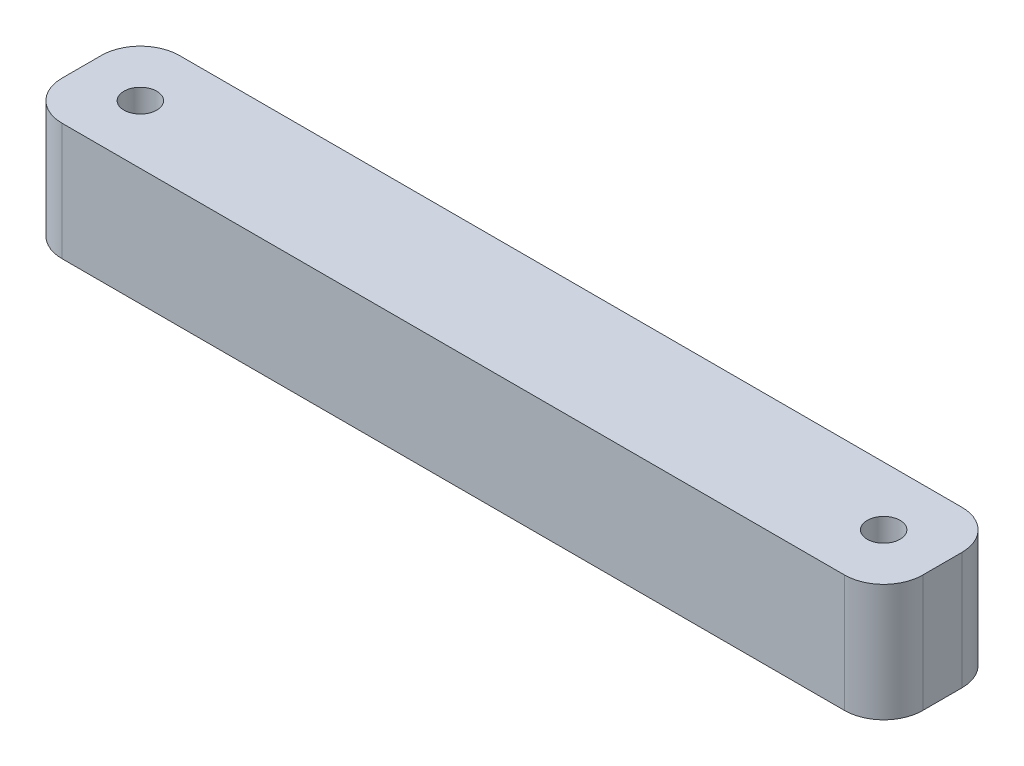
ISO-10303-21;
HEADER;
FILE_DESCRIPTION(('STEP AP214'),'2;1');
FILE_NAME('part.step','',(''),(''),'','','');
FILE_SCHEMA(('AUTOMOTIVE_DESIGN { 1 0 10303 214 1 1 1 1 }'));
ENDSEC;
DATA;
#1=APPLICATION_CONTEXT('core data for automotive mechanical design processes');
#2=APPLICATION_PROTOCOL_DEFINITION('international standard','automotive_design',2000,#1);
#3=PRODUCT_CONTEXT('',#1,'mechanical');
#4=PRODUCT('Part','Part','',(#3));
#5=PRODUCT_RELATED_PRODUCT_CATEGORY('part','',(#4));
#6=PRODUCT_DEFINITION_FORMATION('','',#4);
#7=PRODUCT_DEFINITION_CONTEXT('part definition',#1,'design');
#8=PRODUCT_DEFINITION('design','',#6,#7);
#9=PRODUCT_DEFINITION_SHAPE('','',#8);
#10=(LENGTH_UNIT() NAMED_UNIT(*) SI_UNIT(.MILLI.,.METRE.));
#11=(NAMED_UNIT(*) PLANE_ANGLE_UNIT() SI_UNIT($,.RADIAN.));
#12=(NAMED_UNIT(*) SI_UNIT($,.STERADIAN.) SOLID_ANGLE_UNIT());
#13=UNCERTAINTY_MEASURE_WITH_UNIT(LENGTH_MEASURE(1.E-05),#10,'distance_accuracy_value','');
#14=(GEOMETRIC_REPRESENTATION_CONTEXT(3) GLOBAL_UNCERTAINTY_ASSIGNED_CONTEXT((#13)) GLOBAL_UNIT_ASSIGNED_CONTEXT((#10,
#11,#12)) REPRESENTATION_CONTEXT('',''));
#15=CARTESIAN_POINT('',(0.,0.,0.));
#16=DIRECTION('',(0.,0.,1.));
#17=DIRECTION('',(1.,0.,0.));
#18=AXIS2_PLACEMENT_3D('',#15,#16,#17);
#19=CARTESIAN_POINT('',(0.,15.,0.));
#20=DIRECTION('',(0.,-1.,0.));
#21=DIRECTION('',(0.,0.,-1.));
#22=AXIS2_PLACEMENT_3D('',#19,#20,#21);
#23=PLANE('',#22);
#24=DIRECTION('',(1.,0.,0.));
#25=VECTOR('',#24,1.);
#26=CARTESIAN_POINT('',(0.,15.,0.));
#27=LINE('',#26,#25);
#28=CARTESIAN_POINT('',(5.,15.,0.));
#29=VERTEX_POINT('',#28);
#30=CARTESIAN_POINT('',(105.,15.,0.));
#31=VERTEX_POINT('',#30);
#32=EDGE_CURVE('E200',#29,#31,#27,.T.);
#33=ORIENTED_EDGE('',*,*,#32,.T.);
#34=CARTESIAN_POINT('',(105.,15.,-5.));
#35=DIRECTION('',(0.,-1.,0.));
#36=DIRECTION('',(0.,0.,-1.));
#37=AXIS2_PLACEMENT_3D('',#34,#35,#36);
#38=CIRCLE('',#37,5.);
#39=CARTESIAN_POINT('',(110.,15.,-5.));
#40=VERTEX_POINT('',#39);
#41=EDGE_CURVE('E176',#31,#40,#38,.F.);
#42=ORIENTED_EDGE('',*,*,#41,.T.);
#43=DIRECTION('',(0.,0.,-1.));
#44=VECTOR('',#43,1.);
#45=CARTESIAN_POINT('',(110.,15.,0.));
#46=LINE('',#45,#44);
#47=CARTESIAN_POINT('',(110.,15.,-10.));
#48=VERTEX_POINT('',#47);
#49=EDGE_CURVE('E133',#40,#48,#46,.T.);
#50=ORIENTED_EDGE('',*,*,#49,.T.);
#51=CARTESIAN_POINT('',(105.,15.,-10.));
#52=DIRECTION('',(0.,-1.,0.));
#53=DIRECTION('',(0.,0.,-1.));
#54=AXIS2_PLACEMENT_3D('',#51,#52,#53);
#55=CIRCLE('',#54,5.);
#56=CARTESIAN_POINT('',(105.,15.,-15.));
#57=VERTEX_POINT('',#56);
#58=EDGE_CURVE('E68',#48,#57,#55,.F.);
#59=ORIENTED_EDGE('',*,*,#58,.T.);
#60=DIRECTION('',(-1.,0.,0.));
#61=VECTOR('',#60,1.);
#62=CARTESIAN_POINT('',(0.,15.,-15.));
#63=LINE('',#62,#61);
#64=CARTESIAN_POINT('',(5.,15.,-15.));
#65=VERTEX_POINT('',#64);
#66=EDGE_CURVE('E154',#57,#65,#63,.T.);
#67=ORIENTED_EDGE('',*,*,#66,.T.);
#68=CARTESIAN_POINT('',(5.,15.,-10.));
#69=DIRECTION('',(0.,-1.,0.));
#70=DIRECTION('',(0.,0.,-1.));
#71=AXIS2_PLACEMENT_3D('',#68,#69,#70);
#72=CIRCLE('',#71,5.);
#73=CARTESIAN_POINT('',(0.,15.,-10.));
#74=VERTEX_POINT('',#73);
#75=EDGE_CURVE('E171',#65,#74,#72,.F.);
#76=ORIENTED_EDGE('',*,*,#75,.T.);
#77=DIRECTION('',(0.,0.,1.));
#78=VECTOR('',#77,1.);
#79=CARTESIAN_POINT('',(0.,15.,0.));
#80=LINE('',#79,#78);
#81=CARTESIAN_POINT('',(0.,15.,-5.));
#82=VERTEX_POINT('',#81);
#83=EDGE_CURVE('E147',#74,#82,#80,.T.);
#84=ORIENTED_EDGE('',*,*,#83,.T.);
#85=CARTESIAN_POINT('',(5.,15.,-5.));
#86=DIRECTION('',(0.,-1.,0.));
#87=DIRECTION('',(0.,0.,-1.));
#88=AXIS2_PLACEMENT_3D('',#85,#86,#87);
#89=CIRCLE('',#88,5.);
#90=EDGE_CURVE('E168',#82,#29,#89,.F.);
#91=ORIENTED_EDGE('',*,*,#90,.T.);
#92=EDGE_LOOP('',(#33,#42,#50,#59,#67,#76,#84,#91));
#93=FACE_BOUND('',#92,.T.);
#94=CARTESIAN_POINT('',(7.5,15.,-7.5));
#95=DIRECTION('',(0.,1.,0.));
#96=DIRECTION('',(0.,0.,1.));
#97=AXIS2_PLACEMENT_3D('',#94,#95,#96);
#98=CIRCLE('',#97,2.1);
#99=CARTESIAN_POINT('',(7.5,15.,-5.4));
#100=VERTEX_POINT('',#99);
#101=EDGE_CURVE('E206',#100,#100,#98,.T.);
#102=ORIENTED_EDGE('',*,*,#101,.F.);
#103=EDGE_LOOP('',(#102));
#104=FACE_BOUND('',#103,.T.);
#105=CARTESIAN_POINT('',(102.5,15.,-7.5));
#106=DIRECTION('',(0.,1.,0.));
#107=DIRECTION('',(0.,0.,1.));
#108=AXIS2_PLACEMENT_3D('',#105,#106,#107);
#109=CIRCLE('',#108,2.1);
#110=CARTESIAN_POINT('',(102.5,15.,-5.4));
#111=VERTEX_POINT('',#110);
#112=EDGE_CURVE('E220',#111,#111,#109,.T.);
#113=ORIENTED_EDGE('',*,*,#112,.F.);
#114=EDGE_LOOP('',(#113));
#115=FACE_BOUND('',#114,.T.);
#116=ADVANCED_FACE('F45',(#93,#104,#115),#23,.F.);
#117=CARTESIAN_POINT('',(0.,0.,0.));
#118=DIRECTION('',(0.,-1.,0.));
#119=DIRECTION('',(0.,0.,-1.));
#120=AXIS2_PLACEMENT_3D('',#117,#118,#119);
#121=PLANE('',#120);
#122=CARTESIAN_POINT('',(7.5,0.,-7.5));
#123=DIRECTION('',(0.,1.,0.));
#124=DIRECTION('',(0.,0.,1.));
#125=AXIS2_PLACEMENT_3D('',#122,#123,#124);
#126=CIRCLE('',#125,2.1);
#127=CARTESIAN_POINT('',(7.5,0.,-5.4));
#128=VERTEX_POINT('',#127);
#129=EDGE_CURVE('E209',#128,#128,#126,.T.);
#130=ORIENTED_EDGE('',*,*,#129,.T.);
#131=EDGE_LOOP('',(#130));
#132=FACE_BOUND('',#131,.T.);
#133=DIRECTION('',(0.,0.,-1.));
#134=VECTOR('',#133,1.);
#135=CARTESIAN_POINT('',(110.,0.,0.));
#136=LINE('',#135,#134);
#137=CARTESIAN_POINT('',(110.,0.,-5.));
#138=VERTEX_POINT('',#137);
#139=CARTESIAN_POINT('',(110.,0.,-10.));
#140=VERTEX_POINT('',#139);
#141=EDGE_CURVE('E131',#138,#140,#136,.T.);
#142=ORIENTED_EDGE('',*,*,#141,.F.);
#143=CARTESIAN_POINT('',(105.,0.,-5.));
#144=DIRECTION('',(0.,-1.,0.));
#145=DIRECTION('',(0.,0.,-1.));
#146=AXIS2_PLACEMENT_3D('',#143,#144,#145);
#147=CIRCLE('',#146,5.);
#148=CARTESIAN_POINT('',(105.,0.,0.));
#149=VERTEX_POINT('',#148);
#150=EDGE_CURVE('E113',#138,#149,#147,.T.);
#151=ORIENTED_EDGE('',*,*,#150,.T.);
#152=DIRECTION('',(1.,0.,0.));
#153=VECTOR('',#152,1.);
#154=CARTESIAN_POINT('',(0.,0.,0.));
#155=LINE('',#154,#153);
#156=CARTESIAN_POINT('',(5.,0.,0.));
#157=VERTEX_POINT('',#156);
#158=EDGE_CURVE('E143',#157,#149,#155,.T.);
#159=ORIENTED_EDGE('',*,*,#158,.F.);
#160=CARTESIAN_POINT('',(5.,0.,-5.));
#161=DIRECTION('',(0.,-1.,0.));
#162=DIRECTION('',(0.,0.,-1.));
#163=AXIS2_PLACEMENT_3D('',#160,#161,#162);
#164=CIRCLE('',#163,5.);
#165=CARTESIAN_POINT('',(0.,0.,-5.));
#166=VERTEX_POINT('',#165);
#167=EDGE_CURVE('E135',#157,#166,#164,.T.);
#168=ORIENTED_EDGE('',*,*,#167,.T.);
#169=DIRECTION('',(0.,0.,1.));
#170=VECTOR('',#169,1.);
#171=CARTESIAN_POINT('',(0.,0.,0.));
#172=LINE('',#171,#170);
#173=CARTESIAN_POINT('',(0.,0.,-10.));
#174=VERTEX_POINT('',#173);
#175=EDGE_CURVE('E149',#174,#166,#172,.T.);
#176=ORIENTED_EDGE('',*,*,#175,.F.);
#177=CARTESIAN_POINT('',(5.,0.,-10.));
#178=DIRECTION('',(0.,-1.,0.));
#179=DIRECTION('',(0.,0.,-1.));
#180=AXIS2_PLACEMENT_3D('',#177,#178,#179);
#181=CIRCLE('',#180,5.);
#182=CARTESIAN_POINT('',(5.,0.,-15.));
#183=VERTEX_POINT('',#182);
#184=EDGE_CURVE('E158',#174,#183,#181,.T.);
#185=ORIENTED_EDGE('',*,*,#184,.T.);
#186=DIRECTION('',(-1.,0.,0.));
#187=VECTOR('',#186,1.);
#188=CARTESIAN_POINT('',(0.,0.,-15.));
#189=LINE('',#188,#187);
#190=CARTESIAN_POINT('',(105.,0.,-15.));
#191=VERTEX_POINT('',#190);
#192=EDGE_CURVE('E142',#191,#183,#189,.T.);
#193=ORIENTED_EDGE('',*,*,#192,.F.);
#194=CARTESIAN_POINT('',(105.,0.,-10.));
#195=DIRECTION('',(0.,-1.,0.));
#196=DIRECTION('',(0.,0.,-1.));
#197=AXIS2_PLACEMENT_3D('',#194,#195,#196);
#198=CIRCLE('',#197,5.);
#199=EDGE_CURVE('E125',#191,#140,#198,.T.);
#200=ORIENTED_EDGE('',*,*,#199,.T.);
#201=EDGE_LOOP('',(#142,#151,#159,#168,#176,#185,#193,#200));
#202=FACE_BOUND('',#201,.T.);
#203=CARTESIAN_POINT('',(102.5,0.,-7.5));
#204=DIRECTION('',(0.,1.,0.));
#205=DIRECTION('',(0.,0.,1.));
#206=AXIS2_PLACEMENT_3D('',#203,#204,#205);
#207=CIRCLE('',#206,2.1);
#208=CARTESIAN_POINT('',(102.5,0.,-5.4));
#209=VERTEX_POINT('',#208);
#210=EDGE_CURVE('E222',#209,#209,#207,.T.);
#211=ORIENTED_EDGE('',*,*,#210,.T.);
#212=EDGE_LOOP('',(#211));
#213=FACE_BOUND('',#212,.T.);
#214=ADVANCED_FACE('F138',(#132,#202,#213),#121,.T.);
#215=CARTESIAN_POINT('',(0.,15.,0.));
#216=DIRECTION('',(1.,0.,0.));
#217=DIRECTION('',(0.,0.,-1.));
#218=AXIS2_PLACEMENT_3D('',#215,#216,#217);
#219=PLANE('',#218);
#220=ORIENTED_EDGE('',*,*,#83,.F.);
#221=DIRECTION('',(0.,-1.,0.));
#222=VECTOR('',#221,1.);
#223=CARTESIAN_POINT('',(0.,15.,-10.));
#224=LINE('',#223,#222);
#225=EDGE_CURVE('E11',#74,#174,#224,.T.);
#226=ORIENTED_EDGE('',*,*,#225,.T.);
#227=ORIENTED_EDGE('',*,*,#175,.T.);
#228=DIRECTION('',(0.,-1.,0.));
#229=VECTOR('',#228,1.);
#230=CARTESIAN_POINT('',(0.,15.,-5.));
#231=LINE('',#230,#229);
#232=EDGE_CURVE('E54',#166,#82,#231,.F.);
#233=ORIENTED_EDGE('',*,*,#232,.T.);
#234=EDGE_LOOP('',(#220,#226,#227,#233));
#235=FACE_BOUND('',#234,.T.);
#236=ADVANCED_FACE('F190',(#235),#219,.F.);
#237=CARTESIAN_POINT('',(0.,15.,0.));
#238=DIRECTION('',(0.,0.,-1.));
#239=DIRECTION('',(-1.,0.,0.));
#240=AXIS2_PLACEMENT_3D('',#237,#238,#239);
#241=PLANE('',#240);
#242=ORIENTED_EDGE('',*,*,#158,.T.);
#243=DIRECTION('',(0.,-1.,0.));
#244=VECTOR('',#243,1.);
#245=CARTESIAN_POINT('',(105.,15.,0.));
#246=LINE('',#245,#244);
#247=EDGE_CURVE('E118',#149,#31,#246,.F.);
#248=ORIENTED_EDGE('',*,*,#247,.T.);
#249=ORIENTED_EDGE('',*,*,#32,.F.);
#250=DIRECTION('',(0.,-1.,0.));
#251=VECTOR('',#250,1.);
#252=CARTESIAN_POINT('',(5.,15.,0.));
#253=LINE('',#252,#251);
#254=EDGE_CURVE('E124',#29,#157,#253,.T.);
#255=ORIENTED_EDGE('',*,*,#254,.T.);
#256=EDGE_LOOP('',(#242,#248,#249,#255));
#257=FACE_BOUND('',#256,.T.);
#258=ADVANCED_FACE('F204',(#257),#241,.F.);
#259=CARTESIAN_POINT('',(110.,15.,0.));
#260=DIRECTION('',(-1.,0.,0.));
#261=DIRECTION('',(0.,0.,1.));
#262=AXIS2_PLACEMENT_3D('',#259,#260,#261);
#263=PLANE('',#262);
#264=ORIENTED_EDGE('',*,*,#49,.F.);
#265=DIRECTION('',(0.,-1.,0.));
#266=VECTOR('',#265,1.);
#267=CARTESIAN_POINT('',(110.,15.,-5.));
#268=LINE('',#267,#266);
#269=EDGE_CURVE('E117',#40,#138,#268,.T.);
#270=ORIENTED_EDGE('',*,*,#269,.T.);
#271=ORIENTED_EDGE('',*,*,#141,.T.);
#272=DIRECTION('',(0.,-1.,0.));
#273=VECTOR('',#272,1.);
#274=CARTESIAN_POINT('',(110.,15.,-10.));
#275=LINE('',#274,#273);
#276=EDGE_CURVE('E136',#140,#48,#275,.F.);
#277=ORIENTED_EDGE('',*,*,#276,.T.);
#278=EDGE_LOOP('',(#264,#270,#271,#277));
#279=FACE_BOUND('',#278,.T.);
#280=ADVANCED_FACE('F130',(#279),#263,.F.);
#281=CARTESIAN_POINT('',(0.,15.,-15.));
#282=DIRECTION('',(0.,0.,1.));
#283=DIRECTION('',(1.,0.,0.));
#284=AXIS2_PLACEMENT_3D('',#281,#282,#283);
#285=PLANE('',#284);
#286=ORIENTED_EDGE('',*,*,#66,.F.);
#287=DIRECTION('',(0.,-1.,0.));
#288=VECTOR('',#287,1.);
#289=CARTESIAN_POINT('',(105.,15.,-15.));
#290=LINE('',#289,#288);
#291=EDGE_CURVE('E181',#57,#191,#290,.T.);
#292=ORIENTED_EDGE('',*,*,#291,.T.);
#293=ORIENTED_EDGE('',*,*,#192,.T.);
#294=DIRECTION('',(0.,-1.,0.));
#295=VECTOR('',#294,1.);
#296=CARTESIAN_POINT('',(5.,15.,-15.));
#297=LINE('',#296,#295);
#298=EDGE_CURVE('E61',#183,#65,#297,.F.);
#299=ORIENTED_EDGE('',*,*,#298,.T.);
#300=EDGE_LOOP('',(#286,#292,#293,#299));
#301=FACE_BOUND('',#300,.T.);
#302=ADVANCED_FACE('F245',(#301),#285,.F.);
#303=CARTESIAN_POINT('',(7.5,15.,-7.5));
#304=DIRECTION('',(0.,-1.,0.));
#305=DIRECTION('',(0.,0.,-1.));
#306=AXIS2_PLACEMENT_3D('',#303,#304,#305);
#307=CYLINDRICAL_SURFACE('',#306,2.1);
#308=ORIENTED_EDGE('',*,*,#101,.T.);
#309=EDGE_LOOP('',(#308));
#310=FACE_BOUND('',#309,.T.);
#311=ORIENTED_EDGE('',*,*,#129,.F.);
#312=EDGE_LOOP('',(#311));
#313=FACE_BOUND('',#312,.T.);
#314=ADVANCED_FACE('F242',(#310,#313),#307,.F.);
#315=CARTESIAN_POINT('',(102.5,15.,-7.5));
#316=DIRECTION('',(0.,-1.,0.));
#317=DIRECTION('',(0.,0.,-1.));
#318=AXIS2_PLACEMENT_3D('',#315,#316,#317);
#319=CYLINDRICAL_SURFACE('',#318,2.1);
#320=ORIENTED_EDGE('',*,*,#112,.T.);
#321=EDGE_LOOP('',(#320));
#322=FACE_BOUND('',#321,.T.);
#323=ORIENTED_EDGE('',*,*,#210,.F.);
#324=EDGE_LOOP('',(#323));
#325=FACE_BOUND('',#324,.T.);
#326=ADVANCED_FACE('F230',(#322,#325),#319,.F.);
#327=CARTESIAN_POINT('',(105.,15.,-5.));
#328=DIRECTION('',(0.,-1.,0.));
#329=DIRECTION('',(0.,0.,-1.));
#330=AXIS2_PLACEMENT_3D('',#327,#328,#329);
#331=CYLINDRICAL_SURFACE('',#330,5.);
#332=ORIENTED_EDGE('',*,*,#41,.F.);
#333=ORIENTED_EDGE('',*,*,#247,.F.);
#334=ORIENTED_EDGE('',*,*,#150,.F.);
#335=ORIENTED_EDGE('',*,*,#269,.F.);
#336=EDGE_LOOP('',(#332,#333,#334,#335));
#337=FACE_BOUND('',#336,.T.);
#338=ADVANCED_FACE('F116',(#337),#331,.T.);
#339=CARTESIAN_POINT('',(105.,15.,-10.));
#340=DIRECTION('',(0.,-1.,0.));
#341=DIRECTION('',(0.,0.,-1.));
#342=AXIS2_PLACEMENT_3D('',#339,#340,#341);
#343=CYLINDRICAL_SURFACE('',#342,5.);
#344=ORIENTED_EDGE('',*,*,#58,.F.);
#345=ORIENTED_EDGE('',*,*,#276,.F.);
#346=ORIENTED_EDGE('',*,*,#199,.F.);
#347=ORIENTED_EDGE('',*,*,#291,.F.);
#348=EDGE_LOOP('',(#344,#345,#346,#347));
#349=FACE_BOUND('',#348,.T.);
#350=ADVANCED_FACE('F256',(#349),#343,.T.);
#351=CARTESIAN_POINT('',(5.,15.,-10.));
#352=DIRECTION('',(0.,-1.,0.));
#353=DIRECTION('',(0.,0.,-1.));
#354=AXIS2_PLACEMENT_3D('',#351,#352,#353);
#355=CYLINDRICAL_SURFACE('',#354,5.);
#356=ORIENTED_EDGE('',*,*,#75,.F.);
#357=ORIENTED_EDGE('',*,*,#298,.F.);
#358=ORIENTED_EDGE('',*,*,#184,.F.);
#359=ORIENTED_EDGE('',*,*,#225,.F.);
#360=EDGE_LOOP('',(#356,#357,#358,#359));
#361=FACE_BOUND('',#360,.T.);
#362=ADVANCED_FACE('F258',(#361),#355,.T.);
#363=CARTESIAN_POINT('',(5.,15.,-5.));
#364=DIRECTION('',(0.,-1.,0.));
#365=DIRECTION('',(0.,0.,-1.));
#366=AXIS2_PLACEMENT_3D('',#363,#364,#365);
#367=CYLINDRICAL_SURFACE('',#366,5.);
#368=ORIENTED_EDGE('',*,*,#90,.F.);
#369=ORIENTED_EDGE('',*,*,#232,.F.);
#370=ORIENTED_EDGE('',*,*,#167,.F.);
#371=ORIENTED_EDGE('',*,*,#254,.F.);
#372=EDGE_LOOP('',(#368,#369,#370,#371));
#373=FACE_BOUND('',#372,.T.);
#374=ADVANCED_FACE('F47',(#373),#367,.T.);
#375=CLOSED_SHELL('',(#116,#214,#236,#258,#280,#302,#314,#326,#338,#350,#362,#374));
#376=MANIFOLD_SOLID_BREP('B2',#375);
#377=ADVANCED_BREP_SHAPE_REPRESENTATION('',(#18,#376),#14);
#378=SHAPE_DEFINITION_REPRESENTATION(#9,#377);
ENDSEC;
END-ISO-10303-21;
